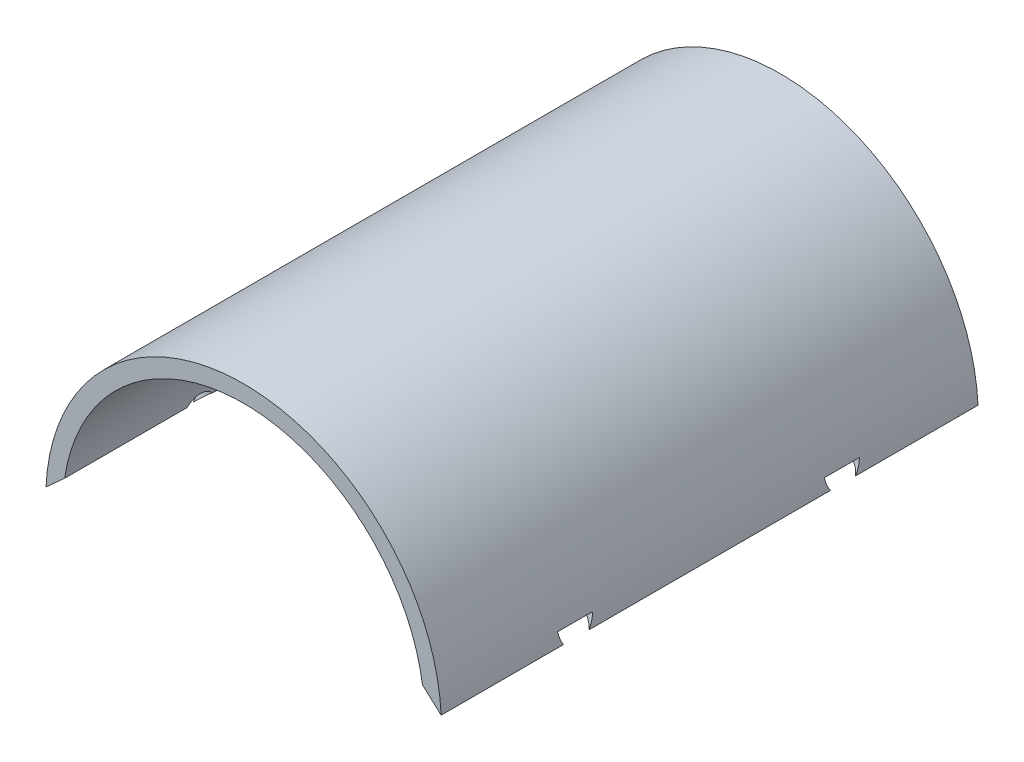
ISO-10303-21;
HEADER;
FILE_DESCRIPTION(('STEP AP214'),'2;1');
FILE_NAME('part.step','',(''),(''),'','','');
FILE_SCHEMA(('AUTOMOTIVE_DESIGN { 1 0 10303 214 1 1 1 1 }'));
ENDSEC;
DATA;
#1=APPLICATION_CONTEXT('core data for automotive mechanical design processes');
#2=APPLICATION_PROTOCOL_DEFINITION('international standard','automotive_design',2000,#1);
#3=PRODUCT_CONTEXT('',#1,'mechanical');
#4=PRODUCT('Part','Part','',(#3));
#5=PRODUCT_RELATED_PRODUCT_CATEGORY('part','',(#4));
#6=PRODUCT_DEFINITION_FORMATION('','',#4);
#7=PRODUCT_DEFINITION_CONTEXT('part definition',#1,'design');
#8=PRODUCT_DEFINITION('design','',#6,#7);
#9=PRODUCT_DEFINITION_SHAPE('','',#8);
#10=(LENGTH_UNIT() NAMED_UNIT(*) SI_UNIT(.MILLI.,.METRE.));
#11=(NAMED_UNIT(*) PLANE_ANGLE_UNIT() SI_UNIT($,.RADIAN.));
#12=(NAMED_UNIT(*) SI_UNIT($,.STERADIAN.) SOLID_ANGLE_UNIT());
#13=UNCERTAINTY_MEASURE_WITH_UNIT(LENGTH_MEASURE(1.E-05),#10,'distance_accuracy_value','');
#14=(GEOMETRIC_REPRESENTATION_CONTEXT(3) GLOBAL_UNCERTAINTY_ASSIGNED_CONTEXT((#13)) GLOBAL_UNIT_ASSIGNED_CONTEXT((#10,
#11,#12)) REPRESENTATION_CONTEXT('',''));
#15=CARTESIAN_POINT('',(0.,0.,0.));
#16=DIRECTION('',(0.,0.,1.));
#17=DIRECTION('',(1.,0.,0.));
#18=AXIS2_PLACEMENT_3D('',#15,#16,#17);
#19=CARTESIAN_POINT('',(40.2038837694651,5.93778829627168,120.65));
#20=DIRECTION('',(0.672307408747508,0.740272077106257,0.));
#21=DIRECTION('',(-0.740272077106257,0.672307408747508,0.));
#22=AXIS2_PLACEMENT_3D('',#19,#20,#21);
#23=PLANE('',#22);
#24=DIRECTION('',(0.,0.,-1.));
#25=VECTOR('',#24,1.);
#26=CARTESIAN_POINT('',(40.2038837694651,5.93778829627168,120.65));
#27=LINE('',#26,#25);
#28=CARTESIAN_POINT('',(40.2038837694651,5.93778829627168,87.4736801787405));
#29=VERTEX_POINT('',#28);
#30=CARTESIAN_POINT('',(40.2038837694651,5.93778829627168,33.1763198212595));
#31=VERTEX_POINT('',#30);
#32=EDGE_CURVE('E176',#29,#31,#27,.T.);
#33=ORIENTED_EDGE('',*,*,#32,.T.);
#34=CARTESIAN_POINT('',(42.3014633715025,4.03278829627168,30.353));
#35=DIRECTION('',(-0.672307408747508,-0.740272077106257,0.));
#36=DIRECTION('',(-0.740272077106257,0.672307408747508,0.));
#37=AXIS2_PLACEMENT_3D('',#34,#35,#36);
#38=CIRCLE('',#37,4.00000000000002);
#39=CARTESIAN_POINT('',(44.39904297354,2.12778829627168,33.1763198212595));
#40=VERTEX_POINT('',#39);
#41=EDGE_CURVE('E158',#40,#31,#38,.T.);
#42=ORIENTED_EDGE('',*,*,#41,.F.);
#43=DIRECTION('',(0.,0.,-1.));
#44=VECTOR('',#43,1.);
#45=CARTESIAN_POINT('',(44.39904297354,2.12778829627168,120.65));
#46=LINE('',#45,#44);
#47=CARTESIAN_POINT('',(44.39904297354,2.12778829627168,87.4736801787405));
#48=VERTEX_POINT('',#47);
#49=EDGE_CURVE('E181',#48,#40,#46,.T.);
#50=ORIENTED_EDGE('',*,*,#49,.F.);
#51=CARTESIAN_POINT('',(42.3014633715025,4.03278829627168,90.297));
#52=DIRECTION('',(-0.672307408747508,-0.740272077106257,0.));
#53=DIRECTION('',(0.740272077106257,-0.672307408747508,0.));
#54=AXIS2_PLACEMENT_3D('',#51,#52,#53);
#55=CIRCLE('',#54,4.00000000000002);
#56=EDGE_CURVE('E163',#29,#48,#55,.T.);
#57=ORIENTED_EDGE('',*,*,#56,.F.);
#58=EDGE_LOOP('',(#33,#42,#50,#57));
#59=FACE_BOUND('',#58,.T.);
#60=ADVANCED_FACE('F35',(#59),#23,.F.);
#61=CARTESIAN_POINT('',(40.2038837694651,5.93778829627168,120.65));
#62=VERTEX_POINT('',#61);
#63=CARTESIAN_POINT('',(40.2038837694651,5.93778829627168,93.1203198212595));
#64=VERTEX_POINT('',#63);
#65=EDGE_CURVE('E179',#62,#64,#27,.T.);
#66=ORIENTED_EDGE('',*,*,#65,.T.);
#67=CARTESIAN_POINT('',(44.39904297354,2.12778829627168,93.1203198212595));
#68=VERTEX_POINT('',#67);
#69=EDGE_CURVE('E241',#68,#64,#55,.T.);
#70=ORIENTED_EDGE('',*,*,#69,.F.);
#71=CARTESIAN_POINT('',(44.39904297354,2.12778829627168,120.65));
#72=VERTEX_POINT('',#71);
#73=EDGE_CURVE('E177',#72,#68,#46,.T.);
#74=ORIENTED_EDGE('',*,*,#73,.F.);
#75=DIRECTION('',(0.740272077106257,-0.672307408747507,0.));
#76=VECTOR('',#75,1.);
#77=CARTESIAN_POINT('',(40.2038837694651,5.93778829627168,120.65));
#78=LINE('',#77,#76);
#79=EDGE_CURVE('E306',#62,#72,#78,.T.);
#80=ORIENTED_EDGE('',*,*,#79,.F.);
#81=EDGE_LOOP('',(#66,#70,#74,#80));
#82=FACE_BOUND('',#81,.T.);
#83=ADVANCED_FACE('F353',(#82),#23,.F.);
#84=CARTESIAN_POINT('',(-40.2038837694651,5.93778829627168,120.65));
#85=DIRECTION('',(-0.672307408747508,0.740272077106257,0.));
#86=DIRECTION('',(-0.740272077106257,-0.672307408747508,0.));
#87=AXIS2_PLACEMENT_3D('',#84,#85,#86);
#88=PLANE('',#87);
#89=DIRECTION('',(0.,0.,-1.));
#90=VECTOR('',#89,1.);
#91=CARTESIAN_POINT('',(-44.39904297354,2.12778829627168,120.65));
#92=LINE('',#91,#90);
#93=CARTESIAN_POINT('',(-44.39904297354,2.12778829627168,87.5259892151859));
#94=VERTEX_POINT('',#93);
#95=CARTESIAN_POINT('',(-44.39904297354,2.12778829627168,33.1240107848141));
#96=VERTEX_POINT('',#95);
#97=EDGE_CURVE('E329',#94,#96,#92,.T.);
#98=ORIENTED_EDGE('',*,*,#97,.T.);
#99=CARTESIAN_POINT('',(-42.3014633715025,4.03278829627168,30.3006909635546));
#100=DIRECTION('',(-0.672307408747508,0.740272077106257,0.));
#101=DIRECTION('',(-0.740272077106257,-0.672307408747508,0.));
#102=AXIS2_PLACEMENT_3D('',#99,#100,#101);
#103=CIRCLE('',#102,4.);
#104=CARTESIAN_POINT('',(-40.2038837694651,5.93778829627168,33.1240107848141));
#105=VERTEX_POINT('',#104);
#106=EDGE_CURVE('E195',#96,#105,#103,.T.);
#107=ORIENTED_EDGE('',*,*,#106,.T.);
#108=DIRECTION('',(0.,0.,-1.));
#109=VECTOR('',#108,1.);
#110=CARTESIAN_POINT('',(-40.2038837694651,5.93778829627168,120.65));
#111=LINE('',#110,#109);
#112=CARTESIAN_POINT('',(-40.2038837694651,5.93778829627169,87.5259892151859));
#113=VERTEX_POINT('',#112);
#114=EDGE_CURVE('E326',#113,#105,#111,.T.);
#115=ORIENTED_EDGE('',*,*,#114,.F.);
#116=CARTESIAN_POINT('',(-42.3014633715025,4.03278829627168,90.3493090364454));
#117=DIRECTION('',(-0.672307408747508,0.740272077106257,0.));
#118=DIRECTION('',(-0.740272077106257,-0.672307408747508,0.));
#119=AXIS2_PLACEMENT_3D('',#116,#117,#118);
#120=CIRCLE('',#119,4.);
#121=EDGE_CURVE('E185',#113,#94,#120,.T.);
#122=ORIENTED_EDGE('',*,*,#121,.T.);
#123=EDGE_LOOP('',(#98,#107,#115,#122));
#124=FACE_BOUND('',#123,.T.);
#125=ADVANCED_FACE('F358',(#124),#88,.F.);
#126=CARTESIAN_POINT('',(-44.39904297354,2.12778829627168,120.65));
#127=VERTEX_POINT('',#126);
#128=CARTESIAN_POINT('',(-44.39904297354,2.12778829627168,93.1726288577048));
#129=VERTEX_POINT('',#128);
#130=EDGE_CURVE('E327',#127,#129,#92,.T.);
#131=ORIENTED_EDGE('',*,*,#130,.T.);
#132=CARTESIAN_POINT('',(-42.3014633715025,4.03278829627168,90.3493090364454));
#133=DIRECTION('',(0.672307408747508,-0.740272077106257,0.));
#134=DIRECTION('',(0.740272077106257,0.672307408747508,0.));
#135=AXIS2_PLACEMENT_3D('',#132,#133,#134);
#136=CIRCLE('',#135,4.);
#137=CARTESIAN_POINT('',(-40.2038837694651,5.93778829627169,93.1726288577048));
#138=VERTEX_POINT('',#137);
#139=EDGE_CURVE('E272',#138,#129,#136,.T.);
#140=ORIENTED_EDGE('',*,*,#139,.F.);
#141=CARTESIAN_POINT('',(-40.2038837694651,5.93778829627168,120.65));
#142=VERTEX_POINT('',#141);
#143=EDGE_CURVE('E322',#142,#138,#111,.T.);
#144=ORIENTED_EDGE('',*,*,#143,.F.);
#145=DIRECTION('',(0.740272077106257,0.672307408747507,0.));
#146=VECTOR('',#145,1.);
#147=CARTESIAN_POINT('',(-40.2038837694651,5.93778829627168,120.65));
#148=LINE('',#147,#146);
#149=EDGE_CURVE('E311',#127,#142,#148,.T.);
#150=ORIENTED_EDGE('',*,*,#149,.F.);
#151=EDGE_LOOP('',(#131,#140,#144,#150));
#152=FACE_BOUND('',#151,.T.);
#153=ADVANCED_FACE('F364',(#152),#88,.F.);
#154=CARTESIAN_POINT('',(0.,0.,120.65));
#155=DIRECTION('',(0.,0.,-1.));
#156=DIRECTION('',(-1.,0.,0.));
#157=AXIS2_PLACEMENT_3D('',#154,#155,#156);
#158=CYLINDRICAL_SURFACE('',#157,40.64);
#159=CARTESIAN_POINT('',(40.2038837694651,5.93778829627168,27.5296801787405));
#160=VERTEX_POINT('',#159);
#161=CARTESIAN_POINT('',(40.2038837694651,5.93778829627168,0.));
#162=VERTEX_POINT('',#161);
#163=EDGE_CURVE('E169',#160,#162,#27,.T.);
#164=ORIENTED_EDGE('',*,*,#163,.F.);
#165=CARTESIAN_POINT('',(40.2038837694651,5.93778829627168,27.5296801787405));
#166=CARTESIAN_POINT('',(40.1913132421633,6.02291585990195,27.596451012384));
#167=CARTESIAN_POINT('',(40.1788118055654,6.10567612462735,27.6663090284334));
#168=CARTESIAN_POINT('',(40.1541531544196,6.26578865022539,27.8121564919255));
#169=CARTESIAN_POINT('',(40.141996254572,6.34313605606763,27.8881513154342));
#170=CARTESIAN_POINT('',(40.1181724615959,6.49211688683358,28.0466650040298));
#171=CARTESIAN_POINT('',(40.1065096054522,6.56370640806695,28.1292259066478));
#172=CARTESIAN_POINT('',(40.084010278307,6.69973661307581,28.3001383550985));
#173=CARTESIAN_POINT('',(40.0731736749685,6.76417844241919,28.3884889693869));
#174=CARTESIAN_POINT('',(40.0525137129598,6.88545967671024,28.5711581372088));
#175=CARTESIAN_POINT('',(40.0426967734591,6.94225151658457,28.6655091010737));
#176=CARTESIAN_POINT('',(40.0244097045485,7.04691787405929,28.8591039358884));
#177=CARTESIAN_POINT('',(40.0159388212325,7.09479738591597,28.9583450268524));
#178=CARTESIAN_POINT('',(40.0005991194072,7.18077811889624,29.1607622636441));
#179=CARTESIAN_POINT('',(39.9937256904317,7.21890751291722,29.2639260593821));
#180=CARTESIAN_POINT('',(39.9817585070471,7.28489638060097,29.4735846116719));
#181=CARTESIAN_POINT('',(39.9766644580635,7.31275755419963,29.5800788136948));
#182=CARTESIAN_POINT('',(39.9688951209998,7.3550954287587,29.7829319276881));
#183=CARTESIAN_POINT('',(39.9660082465001,7.37074734269621,29.879038760085));
#184=CARTESIAN_POINT('',(39.9618273423075,7.39338141912512,30.0722982070598));
#185=CARTESIAN_POINT('',(39.9605331676218,7.40036437080399,30.1694507256303));
#186=CARTESIAN_POINT('',(39.959572741404,7.40554902528821,30.3640426896164));
#187=CARTESIAN_POINT('',(39.9599071437956,7.4037472007363,30.4614822345852));
#188=CARTESIAN_POINT('',(39.9621931505267,7.39139675083092,30.6557577855384));
#189=CARTESIAN_POINT('',(39.9641446988048,7.38084842869079,30.7525938123277));
#190=CARTESIAN_POINT('',(39.9719414920248,7.33855241593988,31.0263064206819));
#191=CARTESIAN_POINT('',(39.9796837595756,7.29642130763879,31.201631266668));
#192=CARTESIAN_POINT('',(39.999871326816,7.18491731329966,31.5428936292308));
#193=CARTESIAN_POINT('',(40.0123158095611,7.11554915923653,31.7088327706885));
#194=CARTESIAN_POINT('',(40.0415424936381,6.94923599022486,32.0348167729333));
#195=CARTESIAN_POINT('',(40.0584870977926,6.85124076692097,32.1943081757798));
#196=CARTESIAN_POINT('',(40.095192960951,6.63304538763832,32.4969532611374));
#197=CARTESIAN_POINT('',(40.1149555090133,6.51283506194859,32.6400994123058));
#198=CARTESIAN_POINT('',(40.1465702815048,6.31406979300915,32.8466060183779));
#199=CARTESIAN_POINT('',(40.1578673895727,6.24187114155978,32.9163169061829));
#200=CARTESIAN_POINT('',(40.1807169493678,6.09304946759938,33.0503146031002));
#201=CARTESIAN_POINT('',(40.1922684964993,6.01644092130682,33.1146176253914));
#202=CARTESIAN_POINT('',(40.2038837694651,5.93778829627168,33.1763198212595));
#203=B_SPLINE_CURVE_WITH_KNOTS('',3,(#165,#166,#167,#168,#169,#170,#171,#172,#173,#174,#175,
#176,#177,#178,#179,#180,#181,#182,#183,#184,#185,#186,#187,#188,#189,#190,#191,#192,#193,#194,
#195,#196,#197,#198,#199,#200,#201,#202),.UNSPECIFIED.,.F.,.F.,(4,2,2,2,2,2,2,2,2,2,2,2,2,2,2,2,
2,2,4),(0.,0.326735220214415,0.653759843865201,0.98307921047325,1.312345720231,1.64357330309619,
1.97461471142325,2.30468848457326,2.63470758840895,2.92656284759356,3.21839153549948,
3.51033741122769,3.80227316654107,4.34104349743155,4.87972026749844,5.4413775079196,
6.00329250565088,6.30606558674257,6.60789591837461),.UNSPECIFIED.);
#204=EDGE_CURVE('E153',#160,#31,#203,.T.);
#205=ORIENTED_EDGE('',*,*,#204,.T.);
#206=ORIENTED_EDGE('',*,*,#32,.F.);
#207=CARTESIAN_POINT('',(40.2038837694651,5.93778829627168,87.4736801787405));
#208=CARTESIAN_POINT('',(40.1913132421633,6.02291585990195,87.540451012384));
#209=CARTESIAN_POINT('',(40.1788118055654,6.10567612462735,87.6103090284334));
#210=CARTESIAN_POINT('',(40.1541531544196,6.26578865022539,87.7561564919255));
#211=CARTESIAN_POINT('',(40.141996254572,6.34313605606764,87.8321513154342));
#212=CARTESIAN_POINT('',(40.1181724615959,6.49211688683358,87.9906650040298));
#213=CARTESIAN_POINT('',(40.1065096054522,6.56370640806694,88.0732259066478));
#214=CARTESIAN_POINT('',(40.084010278307,6.6997366130758,88.2441383550985));
#215=CARTESIAN_POINT('',(40.0731736749685,6.76417844241919,88.3324889693869));
#216=CARTESIAN_POINT('',(40.0525137129598,6.88545967671024,88.5151581372088));
#217=CARTESIAN_POINT('',(40.0426967734591,6.94225151658456,88.6095091010737));
#218=CARTESIAN_POINT('',(40.0244097045485,7.04691787405929,88.8031039358883));
#219=CARTESIAN_POINT('',(40.0159388212325,7.09479738591596,88.9023450268524));
#220=CARTESIAN_POINT('',(40.0005991194072,7.18077811889623,89.1047622636441));
#221=CARTESIAN_POINT('',(39.9937256904317,7.21890751291721,89.2079260593821));
#222=CARTESIAN_POINT('',(39.9817585070471,7.28489638060097,89.4175846116719));
#223=CARTESIAN_POINT('',(39.9766644580635,7.31275755419963,89.5240788136948));
#224=CARTESIAN_POINT('',(39.9688951209998,7.3550954287587,89.7269319276881));
#225=CARTESIAN_POINT('',(39.9660082465001,7.37074734269621,89.823038760085));
#226=CARTESIAN_POINT('',(39.9618273423075,7.39338141912511,90.0162982070597));
#227=CARTESIAN_POINT('',(39.9605331676218,7.40036437080399,90.1134507256303));
#228=CARTESIAN_POINT('',(39.959572741404,7.40554902528821,90.3080426896164));
#229=CARTESIAN_POINT('',(39.9599071437956,7.4037472007363,90.4054822345852));
#230=CARTESIAN_POINT('',(39.9621931505267,7.39139675083092,90.5997577855384));
#231=CARTESIAN_POINT('',(39.9641446988048,7.38084842869079,90.6965938123276));
#232=CARTESIAN_POINT('',(39.9719414920248,7.33855241593988,90.9703064206819));
#233=CARTESIAN_POINT('',(39.9796837595757,7.29642130763879,91.1456312666679));
#234=CARTESIAN_POINT('',(39.999871326816,7.18491731329966,91.4868936292307));
#235=CARTESIAN_POINT('',(40.0123158095611,7.11554915923654,91.6528327706884));
#236=CARTESIAN_POINT('',(40.0415424936381,6.94923599022487,91.9788167729333));
#237=CARTESIAN_POINT('',(40.0584870977926,6.85124076692097,92.1383081757797));
#238=CARTESIAN_POINT('',(40.095192960951,6.63304538763832,92.4409532611373));
#239=CARTESIAN_POINT('',(40.1149555090133,6.51283506194859,92.5840994123058));
#240=CARTESIAN_POINT('',(40.1465702815048,6.31406979300915,92.7906060183779));
#241=CARTESIAN_POINT('',(40.1578673895727,6.24187114155979,92.8603169061829));
#242=CARTESIAN_POINT('',(40.1807169493678,6.09304946759939,92.9943146031002));
#243=CARTESIAN_POINT('',(40.1922684964993,6.01644092130683,93.0586176253914));
#244=CARTESIAN_POINT('',(40.2038837694651,5.93778829627168,93.1203198212595));
#245=B_SPLINE_CURVE_WITH_KNOTS('',3,(#207,#208,#209,#210,#211,#212,#213,#214,#215,#216,#217,
#218,#219,#220,#221,#222,#223,#224,#225,#226,#227,#228,#229,#230,#231,#232,#233,#234,#235,#236,
#237,#238,#239,#240,#241,#242,#243,#244),.UNSPECIFIED.,.F.,.F.,(4,2,2,2,2,2,2,2,2,2,2,2,2,2,2,2,
2,2,4),(0.,0.326735220214426,0.653759843865201,0.983079210473233,1.312345720231,
1.64357330309617,1.97461471142324,2.30468848457325,2.63470758840894,2.92656284759355,
3.21839153549947,3.5103374112277,3.80227316654106,4.34104349743154,4.87972026749842,
5.44137750791958,6.00329250565088,6.30606558674256,6.60789591837461),.UNSPECIFIED.);
#246=EDGE_CURVE('E233',#29,#64,#245,.T.);
#247=ORIENTED_EDGE('',*,*,#246,.T.);
#248=ORIENTED_EDGE('',*,*,#65,.F.);
#249=CARTESIAN_POINT('',(0.,0.,120.65));
#250=DIRECTION('',(0.,0.,-1.));
#251=DIRECTION('',(1.,0.,0.));
#252=AXIS2_PLACEMENT_3D('',#249,#250,#251);
#253=CIRCLE('',#252,40.64);
#254=EDGE_CURVE('E303',#142,#62,#253,.T.);
#255=ORIENTED_EDGE('',*,*,#254,.F.);
#256=ORIENTED_EDGE('',*,*,#143,.T.);
#257=CARTESIAN_POINT('',(-40.2038837694651,5.93778829627167,93.1726288577048));
#258=CARTESIAN_POINT('',(-40.1913132421633,6.02291585990194,93.1058580240613));
#259=CARTESIAN_POINT('',(-40.1788118055654,6.10567612462734,93.0360000080119));
#260=CARTESIAN_POINT('',(-40.1541531544196,6.26578865022537,92.8901525445199));
#261=CARTESIAN_POINT('',(-40.141996254572,6.34313605606762,92.8141577210111));
#262=CARTESIAN_POINT('',(-40.1181724615959,6.49211688683357,92.6556440324156));
#263=CARTESIAN_POINT('',(-40.1065096054522,6.56370640806693,92.5730831297976));
#264=CARTESIAN_POINT('',(-40.084010278307,6.6997366130758,92.4021706813468));
#265=CARTESIAN_POINT('',(-40.0731736749685,6.76417844241918,92.3138200670584));
#266=CARTESIAN_POINT('',(-40.0525137129598,6.88545967671023,92.1311508992366));
#267=CARTESIAN_POINT('',(-40.0426967734591,6.94225151658455,92.0367999353717));
#268=CARTESIAN_POINT('',(-40.0244097045485,7.04691787405928,91.843205100557));
#269=CARTESIAN_POINT('',(-40.0159388212325,7.09479738591595,91.743964009593));
#270=CARTESIAN_POINT('',(-40.0005991194072,7.18077811889622,91.5415467728012));
#271=CARTESIAN_POINT('',(-39.9937256904317,7.2189075129172,91.4383829770633));
#272=CARTESIAN_POINT('',(-39.9817585070471,7.28489638060096,91.2287244247735));
#273=CARTESIAN_POINT('',(-39.9766644580635,7.31275755419961,91.1222302227506));
#274=CARTESIAN_POINT('',(-39.9688951209998,7.35509542875868,90.9193771087572));
#275=CARTESIAN_POINT('',(-39.9660082465001,7.3707473426962,90.8232702763604));
#276=CARTESIAN_POINT('',(-39.9618273423075,7.3933814191251,90.6300108293856));
#277=CARTESIAN_POINT('',(-39.9605331676218,7.40036437080398,90.5328583108151));
#278=CARTESIAN_POINT('',(-39.959572741404,7.4055490252882,90.338266346829));
#279=CARTESIAN_POINT('',(-39.9599071437956,7.40374720073629,90.2408268018602));
#280=CARTESIAN_POINT('',(-39.9621931505267,7.39139675083091,90.0465512509069));
#281=CARTESIAN_POINT('',(-39.9641446988048,7.38084842869078,89.9497152241177));
#282=CARTESIAN_POINT('',(-39.9719414920248,7.33855241593987,89.6760026157635));
#283=CARTESIAN_POINT('',(-39.9796837595757,7.29642130763877,89.5006777697774));
#284=CARTESIAN_POINT('',(-39.999871326816,7.18491731329965,89.1594154072146));
#285=CARTESIAN_POINT('',(-40.0123158095611,7.11554915923652,88.9934762657569));
#286=CARTESIAN_POINT('',(-40.0415424936381,6.94923599022484,88.667492263512));
#287=CARTESIAN_POINT('',(-40.0584870977926,6.85124076692095,88.5080008606656));
#288=CARTESIAN_POINT('',(-40.095192960951,6.63304538763829,88.205355775308));
#289=CARTESIAN_POINT('',(-40.1149555090133,6.51283506194857,88.0622096241396));
#290=CARTESIAN_POINT('',(-40.1465702815048,6.31406979300912,87.8557030180675));
#291=CARTESIAN_POINT('',(-40.1578673895727,6.24187114155976,87.7859921302624));
#292=CARTESIAN_POINT('',(-40.1807169493678,6.09304946759937,87.6519944333452));
#293=CARTESIAN_POINT('',(-40.1922684964993,6.01644092130681,87.587691411054));
#294=CARTESIAN_POINT('',(-40.2038837694651,5.93778829627167,87.5259892151859));
#295=B_SPLINE_CURVE_WITH_KNOTS('',3,(#257,#258,#259,#260,#261,#262,#263,#264,#265,#266,#267,
#268,#269,#270,#271,#272,#273,#274,#275,#276,#277,#278,#279,#280,#281,#282,#283,#284,#285,#286,
#287,#288,#289,#290,#291,#292,#293,#294),.UNSPECIFIED.,.F.,.F.,(4,2,2,2,2,2,2,2,2,2,2,2,2,2,2,2,
2,2,4),(0.,0.326735220214421,0.653759843865193,0.983079210473235,1.312345720231,
1.64357330309616,1.97461471142325,2.30468848457324,2.63470758840894,2.92656284759352,
3.21839153549946,3.51033741122766,3.80227316654105,4.34104349743152,4.87972026749842,
5.44137750791959,6.00329250565087,6.30606558674255,6.60789591837458),.UNSPECIFIED.);
#296=EDGE_CURVE('E297',#138,#113,#295,.T.);
#297=ORIENTED_EDGE('',*,*,#296,.T.);
#298=ORIENTED_EDGE('',*,*,#114,.T.);
#299=CARTESIAN_POINT('',(-40.2038837694651,5.93778829627168,33.1240107848141));
#300=CARTESIAN_POINT('',(-40.1913132421633,6.02291585990194,33.0572399511706));
#301=CARTESIAN_POINT('',(-40.1788118055654,6.10567612462734,32.9873819351212));
#302=CARTESIAN_POINT('',(-40.1541531544196,6.26578865022537,32.8415344716291));
#303=CARTESIAN_POINT('',(-40.141996254572,6.34313605606762,32.7655396481204));
#304=CARTESIAN_POINT('',(-40.1181724615959,6.49211688683357,32.6070259595248));
#305=CARTESIAN_POINT('',(-40.1065096054522,6.56370640806693,32.5244650569068));
#306=CARTESIAN_POINT('',(-40.084010278307,6.6997366130758,32.3535526084561));
#307=CARTESIAN_POINT('',(-40.0731736749685,6.76417844241917,32.2652019941677));
#308=CARTESIAN_POINT('',(-40.0525137129598,6.88545967671023,32.0825328263458));
#309=CARTESIAN_POINT('',(-40.0426967734591,6.94225151658456,31.988181862481));
#310=CARTESIAN_POINT('',(-40.0244097045485,7.04691787405929,31.7945870276663));
#311=CARTESIAN_POINT('',(-40.0159388212325,7.09479738591596,31.6953459367022));
#312=CARTESIAN_POINT('',(-40.0005991194072,7.18077811889622,31.4929286999105));
#313=CARTESIAN_POINT('',(-39.9937256904317,7.21890751291721,31.3897649041725));
#314=CARTESIAN_POINT('',(-39.9817585070471,7.28489638060096,31.1801063518827));
#315=CARTESIAN_POINT('',(-39.9766644580635,7.31275755419961,31.0736121498598));
#316=CARTESIAN_POINT('',(-39.9688951209998,7.35509542875868,30.8707590358665));
#317=CARTESIAN_POINT('',(-39.9660082465001,7.3707473426962,30.7746522034696));
#318=CARTESIAN_POINT('',(-39.9618273423075,7.3933814191251,30.5813927564949));
#319=CARTESIAN_POINT('',(-39.9605331676218,7.40036437080397,30.4842402379243));
#320=CARTESIAN_POINT('',(-39.959572741404,7.40554902528819,30.2896482739382));
#321=CARTESIAN_POINT('',(-39.9599071437956,7.40374720073629,30.1922087289694));
#322=CARTESIAN_POINT('',(-39.9621931505267,7.39139675083091,29.9979331780162));
#323=CARTESIAN_POINT('',(-39.9641446988048,7.38084842869078,29.901097151227));
#324=CARTESIAN_POINT('',(-39.9719414920248,7.33855241593987,29.6273845428728));
#325=CARTESIAN_POINT('',(-39.9796837595757,7.29642130763878,29.4520596968867));
#326=CARTESIAN_POINT('',(-39.999871326816,7.18491731329965,29.1107973343239));
#327=CARTESIAN_POINT('',(-40.0123158095611,7.11554915923652,28.9448581928662));
#328=CARTESIAN_POINT('',(-40.0415424936381,6.94923599022484,28.6188741906213));
#329=CARTESIAN_POINT('',(-40.0584870977926,6.85124076692095,28.4593827877749));
#330=CARTESIAN_POINT('',(-40.095192960951,6.6330453876383,28.1567377024173));
#331=CARTESIAN_POINT('',(-40.1149555090133,6.51283506194858,28.0135915512489));
#332=CARTESIAN_POINT('',(-40.1465702815048,6.31406979300913,27.8070849451767));
#333=CARTESIAN_POINT('',(-40.1578673895727,6.24187114155977,27.7373740573717));
#334=CARTESIAN_POINT('',(-40.1807169493678,6.09304946759938,27.6033763604544));
#335=CARTESIAN_POINT('',(-40.1922684964993,6.01644092130682,27.5390733381633));
#336=CARTESIAN_POINT('',(-40.2038837694651,5.93778829627167,27.4773711422952));
#337=B_SPLINE_CURVE_WITH_KNOTS('',3,(#299,#300,#301,#302,#303,#304,#305,#306,#307,#308,#309,
#310,#311,#312,#313,#314,#315,#316,#317,#318,#319,#320,#321,#322,#323,#324,#325,#326,#327,#328,
#329,#330,#331,#332,#333,#334,#335,#336),.UNSPECIFIED.,.F.,.F.,(4,2,2,2,2,2,2,2,2,2,2,2,2,2,2,2,
2,2,4),(0.,0.326735220214414,0.653759843865197,0.983079210473239,1.31234572023099,
1.64357330309618,1.97461471142325,2.30468848457325,2.63470758840894,2.92656284759353,
3.21839153549946,3.51033741122767,3.80227316654105,4.34104349743152,4.87972026749841,
5.44137750791957,6.00329250565085,6.30606558674253,6.60789591837457),.UNSPECIFIED.);
#338=CARTESIAN_POINT('',(-40.2038837694651,5.93778829627168,27.4773711422952));
#339=VERTEX_POINT('',#338);
#340=EDGE_CURVE('E266',#105,#339,#337,.T.);
#341=ORIENTED_EDGE('',*,*,#340,.T.);
#342=CARTESIAN_POINT('',(-40.2038837694651,5.93778829627168,0.));
#343=VERTEX_POINT('',#342);
#344=EDGE_CURVE('E313',#339,#343,#111,.T.);
#345=ORIENTED_EDGE('',*,*,#344,.T.);
#346=CARTESIAN_POINT('',(0.,0.,0.));
#347=DIRECTION('',(0.,0.,-1.));
#348=DIRECTION('',(1.,0.,0.));
#349=AXIS2_PLACEMENT_3D('',#346,#347,#348);
#350=CIRCLE('',#349,40.64);
#351=EDGE_CURVE('E175',#343,#162,#350,.T.);
#352=ORIENTED_EDGE('',*,*,#351,.T.);
#353=EDGE_LOOP('',(#164,#205,#206,#247,#248,#255,#256,#297,#298,#341,#345,#352));
#354=FACE_BOUND('',#353,.T.);
#355=ADVANCED_FACE('F37',(#354),#158,.F.);
#356=CARTESIAN_POINT('',(44.39904297354,2.12778829627168,27.5296801787405));
#357=VERTEX_POINT('',#356);
#358=CARTESIAN_POINT('',(44.39904297354,2.12778829627168,0.));
#359=VERTEX_POINT('',#358);
#360=EDGE_CURVE('E171',#357,#359,#46,.T.);
#361=ORIENTED_EDGE('',*,*,#360,.F.);
#362=EDGE_CURVE('E156',#160,#357,#38,.T.);
#363=ORIENTED_EDGE('',*,*,#362,.F.);
#364=ORIENTED_EDGE('',*,*,#163,.T.);
#365=DIRECTION('',(0.740272077106257,-0.672307408747507,0.));
#366=VECTOR('',#365,1.);
#367=CARTESIAN_POINT('',(40.2038837694651,5.93778829627168,0.));
#368=LINE('',#367,#366);
#369=EDGE_CURVE('E315',#162,#359,#368,.T.);
#370=ORIENTED_EDGE('',*,*,#369,.T.);
#371=EDGE_LOOP('',(#361,#363,#364,#370));
#372=FACE_BOUND('',#371,.T.);
#373=ADVANCED_FACE('F167',(#372),#23,.F.);
#374=CARTESIAN_POINT('',(0.,0.,120.65));
#375=DIRECTION('',(0.,0.,-1.));
#376=DIRECTION('',(-1.,0.,0.));
#377=AXIS2_PLACEMENT_3D('',#374,#375,#376);
#378=CYLINDRICAL_SURFACE('',#377,44.45);
#379=DIRECTION('',(0.,0.,-1.));
#380=VECTOR('',#379,1.);
#381=CARTESIAN_POINT('',(44.1628902552898,5.0439691017319,120.65));
#382=LINE('',#381,#380);
#383=CARTESIAN_POINT('',(44.1628902552898,5.0439691017319,34.2916042369071));
#384=VERTEX_POINT('',#383);
#385=CARTESIAN_POINT('',(44.1628902552898,5.0439691017319,26.4143957630929));
#386=VERTEX_POINT('',#385);
#387=EDGE_CURVE('E499',#384,#386,#382,.T.);
#388=ORIENTED_EDGE('',*,*,#387,.T.);
#389=CARTESIAN_POINT('',(44.1628902552898,5.0439691017319,26.4143957630929));
#390=CARTESIAN_POINT('',(44.1820882207202,4.87594230518134,26.4369589502951));
#391=CARTESIAN_POINT('',(44.2002218425883,4.70860522803788,26.465614336531));
#392=CARTESIAN_POINT('',(44.2343731536034,4.37612964124249,26.5350658009129));
#393=CARTESIAN_POINT('',(44.2503893669069,4.21099273646198,26.575870283281));
#394=CARTESIAN_POINT('',(44.2800115624876,3.8870390773206,26.6686662679598));
#395=CARTESIAN_POINT('',(44.2936571173332,3.72816187528309,26.7204335879432));
#396=CARTESIAN_POINT('',(44.3189313479414,3.41460828009221,26.8356300748707));
#397=CARTESIAN_POINT('',(44.330560895291,3.25993009608054,26.8990541776434));
#398=CARTESIAN_POINT('',(44.3531677738895,2.93737590671437,27.0461843089747));
#399=CARTESIAN_POINT('',(44.363895738379,2.77016886967958,27.1314161147886));
#400=CARTESIAN_POINT('',(44.3783028882209,2.52498528170084,27.2712161995369));
#401=CARTESIAN_POINT('',(44.3828439396484,2.44378091214642,27.3200991618397));
#402=CARTESIAN_POINT('',(44.3913614431513,2.28384625817868,27.4218688486936));
#403=CARTESIAN_POINT('',(44.3953376652043,2.20511699183729,27.4747571910389));
#404=CARTESIAN_POINT('',(44.39904297354,2.12778829627168,27.5296801787405));
#405=B_SPLINE_CURVE_WITH_KNOTS('',3,(#389,#390,#391,#392,#393,#394,#395,#396,#397,#398,#399,
#400,#401,#402,#403,#404),.UNSPECIFIED.,.F.,.F.,(4,2,2,2,2,2,2,4),(0.,0.511752184475265,
1.0238592028553,1.52636097799275,2.02864496014023,2.59173143963583,2.87630157654165,
3.16098727221963),.UNSPECIFIED.);
#406=EDGE_CURVE('E11',#386,#357,#405,.T.);
#407=ORIENTED_EDGE('',*,*,#406,.T.);
#408=ORIENTED_EDGE('',*,*,#360,.T.);
#409=CARTESIAN_POINT('',(0.,0.,0.));
#410=DIRECTION('',(0.,0.,1.));
#411=DIRECTION('',(1.,0.,0.));
#412=AXIS2_PLACEMENT_3D('',#409,#410,#411);
#413=CIRCLE('',#412,44.45);
#414=CARTESIAN_POINT('',(-44.39904297354,2.12778829627168,0.));
#415=VERTEX_POINT('',#414);
#416=EDGE_CURVE('E317',#359,#415,#413,.T.);
#417=ORIENTED_EDGE('',*,*,#416,.T.);
#418=CARTESIAN_POINT('',(-44.39904297354,2.12778829627168,27.4773711422952));
#419=VERTEX_POINT('',#418);
#420=EDGE_CURVE('E325',#419,#415,#92,.T.);
#421=ORIENTED_EDGE('',*,*,#420,.F.);
#422=CARTESIAN_POINT('',(-44.39904297354,2.12778829627168,27.4773711422952));
#423=CARTESIAN_POINT('',(-44.3923544121857,2.26755422855095,27.378155847459));
#424=CARTESIAN_POINT('',(-44.3847697444573,2.41182904743819,27.2855401359274));
#425=CARTESIAN_POINT('',(-44.3676992322139,2.70766808373903,27.1132105158601));
#426=CARTESIAN_POINT('',(-44.3582146804163,2.85922729170751,27.0334879009192));
#427=CARTESIAN_POINT('',(-44.3374132457908,3.16535500446612,26.8878200356389));
#428=CARTESIAN_POINT('',(-44.3261319375629,3.31982210178385,26.8216550393622));
#429=CARTESIAN_POINT('',(-44.3015526560469,3.63312860846835,26.7011555220595));
#430=CARTESIAN_POINT('',(-44.2882547656636,3.79196783787063,26.6468205149087));
#431=CARTESIAN_POINT('',(-44.258059245395,4.13018844143036,26.5446805041716));
#432=CARTESIAN_POINT('',(-44.2409286505058,4.30994855252608,26.4981972670406));
#433=CARTESIAN_POINT('',(-44.2039449863492,4.67416719068071,26.419273111564));
#434=CARTESIAN_POINT('',(-44.184066246256,4.85865479889098,26.3869782665967));
#435=CARTESIAN_POINT('',(-44.1628902552898,5.04396910173189,26.3620867266475));
#436=B_SPLINE_CURVE_WITH_KNOTS('',3,(#422,#423,#424,#425,#426,#427,#428,#429,#430,#431,#432,
#433,#434,#435),.UNSPECIFIED.,.F.,.F.,(4,2,2,2,2,2,4),(0.,0.514248289297659,1.02814785559117,
1.53291089918042,2.03765319683236,2.59643000698799,3.16083196864485),.UNSPECIFIED.);
#437=CARTESIAN_POINT('',(-44.1628902552898,5.0439691017319,26.3620867266475));
#438=VERTEX_POINT('',#437);
#439=EDGE_CURVE('E246',#419,#438,#436,.T.);
#440=ORIENTED_EDGE('',*,*,#439,.T.);
#441=DIRECTION('',(0.,0.,-1.));
#442=VECTOR('',#441,1.);
#443=CARTESIAN_POINT('',(-44.1628902552898,5.0439691017319,120.65));
#444=LINE('',#443,#442);
#445=CARTESIAN_POINT('',(-44.1628902552898,5.0439691017319,34.2392952004617));
#446=VERTEX_POINT('',#445);
#447=EDGE_CURVE('E200',#438,#446,#444,.F.);
#448=ORIENTED_EDGE('',*,*,#447,.T.);
#449=CARTESIAN_POINT('',(-44.1628902552898,5.0439691017319,34.2392952004617));
#450=CARTESIAN_POINT('',(-44.1820882207202,4.87594230518133,34.2167320132595));
#451=CARTESIAN_POINT('',(-44.2002218425883,4.70860522803788,34.1880766270237));
#452=CARTESIAN_POINT('',(-44.2343731536034,4.37612964124249,34.1186251626417));
#453=CARTESIAN_POINT('',(-44.2503893669069,4.21099273646198,34.0778206802736));
#454=CARTESIAN_POINT('',(-44.2800115624876,3.8870390773206,33.9850246955948));
#455=CARTESIAN_POINT('',(-44.2936571173332,3.7281618752831,33.9332573756114));
#456=CARTESIAN_POINT('',(-44.3189313479414,3.41460828009222,33.8180608886839));
#457=CARTESIAN_POINT('',(-44.330560895291,3.25993009608055,33.7546367859112));
#458=CARTESIAN_POINT('',(-44.3531677738895,2.93737590671438,33.6075066545799));
#459=CARTESIAN_POINT('',(-44.363895738379,2.77016886967958,33.522274848766));
#460=CARTESIAN_POINT('',(-44.3783028882209,2.52498528170085,33.3824747640177));
#461=CARTESIAN_POINT('',(-44.3828439396484,2.44378091214642,33.3335918017149));
#462=CARTESIAN_POINT('',(-44.3913614431513,2.28384625817868,33.231822114861));
#463=CARTESIAN_POINT('',(-44.3953376652043,2.20511699183729,33.1789337725157));
#464=CARTESIAN_POINT('',(-44.39904297354,2.12778829627168,33.1240107848141));
#465=B_SPLINE_CURVE_WITH_KNOTS('',3,(#449,#450,#451,#452,#453,#454,#455,#456,#457,#458,#459,
#460,#461,#462,#463,#464),.UNSPECIFIED.,.F.,.F.,(4,2,2,2,2,2,2,4),(0.,0.51175218447526,
1.02385920285529,1.52636097799274,2.02864496014022,2.59173143963582,2.87630157654165,
3.16098727221964),.UNSPECIFIED.);
#466=EDGE_CURVE('E253',#446,#96,#465,.T.);
#467=ORIENTED_EDGE('',*,*,#466,.T.);
#468=ORIENTED_EDGE('',*,*,#97,.F.);
#469=CARTESIAN_POINT('',(-44.39904297354,2.12778829627168,87.5259892151859));
#470=CARTESIAN_POINT('',(-44.3923544121857,2.26755422855095,87.4267739203498));
#471=CARTESIAN_POINT('',(-44.3847697444573,2.41182904743819,87.3341582088181));
#472=CARTESIAN_POINT('',(-44.3676992322139,2.70766808373903,87.1618285887508));
#473=CARTESIAN_POINT('',(-44.3582146804163,2.85922729170751,87.0821059738099));
#474=CARTESIAN_POINT('',(-44.3374132457908,3.16535500446612,86.9364381085296));
#475=CARTESIAN_POINT('',(-44.3261319375629,3.31982210178386,86.8702731122529));
#476=CARTESIAN_POINT('',(-44.3015526560469,3.63312860846835,86.7497735949502));
#477=CARTESIAN_POINT('',(-44.2882547656636,3.79196783787063,86.6954385877994));
#478=CARTESIAN_POINT('',(-44.258059245395,4.13018844143036,86.5932985770624));
#479=CARTESIAN_POINT('',(-44.2409286505058,4.30994855252608,86.5468153399313));
#480=CARTESIAN_POINT('',(-44.2039449863492,4.67416719068071,86.4678911844547));
#481=CARTESIAN_POINT('',(-44.1840662462561,4.85865479889098,86.4355963394875));
#482=CARTESIAN_POINT('',(-44.1628902552898,5.0439691017319,86.4107047995383));
#483=B_SPLINE_CURVE_WITH_KNOTS('',3,(#469,#470,#471,#472,#473,#474,#475,#476,#477,#478,#479,
#480,#481,#482),.UNSPECIFIED.,.F.,.F.,(4,2,2,2,2,2,4),(0.,0.514248289297654,1.02814785559117,
1.53291089918042,2.03765319683236,2.59643000698798,3.16083196864484),.UNSPECIFIED.);
#484=CARTESIAN_POINT('',(-44.1628902552898,5.0439691017319,86.4107047995383));
#485=VERTEX_POINT('',#484);
#486=EDGE_CURVE('E283',#94,#485,#483,.T.);
#487=ORIENTED_EDGE('',*,*,#486,.T.);
#488=DIRECTION('',(0.,0.,-1.));
#489=VECTOR('',#488,1.);
#490=CARTESIAN_POINT('',(-44.1628902552898,5.0439691017319,120.65));
#491=LINE('',#490,#489);
#492=CARTESIAN_POINT('',(-44.1628902552898,5.0439691017319,94.2879132733525));
#493=VERTEX_POINT('',#492);
#494=EDGE_CURVE('E190',#493,#485,#491,.T.);
#495=ORIENTED_EDGE('',*,*,#494,.F.);
#496=CARTESIAN_POINT('',(-44.1628902552898,5.0439691017319,94.2879132733525));
#497=CARTESIAN_POINT('',(-44.1820882207202,4.87594230518133,94.2653500861503));
#498=CARTESIAN_POINT('',(-44.2002218425883,4.70860522803788,94.2366946999144));
#499=CARTESIAN_POINT('',(-44.2343731536034,4.37612964124249,94.1672432355325));
#500=CARTESIAN_POINT('',(-44.2503893669069,4.21099273646198,94.1264387531643));
#501=CARTESIAN_POINT('',(-44.2800115624876,3.8870390773206,94.0336427684855));
#502=CARTESIAN_POINT('',(-44.2936571173332,3.7281618752831,93.9818754485021));
#503=CARTESIAN_POINT('',(-44.3189313479414,3.41460828009222,93.8666789615746));
#504=CARTESIAN_POINT('',(-44.330560895291,3.25993009608055,93.8032548588019));
#505=CARTESIAN_POINT('',(-44.3531677738895,2.93737590671438,93.6561247274707));
#506=CARTESIAN_POINT('',(-44.363895738379,2.77016886967959,93.5708929216567));
#507=CARTESIAN_POINT('',(-44.3783028882209,2.52498528170085,93.4310928369085));
#508=CARTESIAN_POINT('',(-44.3828439396484,2.44378091214642,93.3822098746056));
#509=CARTESIAN_POINT('',(-44.3913614431513,2.28384625817868,93.2804401877518));
#510=CARTESIAN_POINT('',(-44.3953376652043,2.20511699183729,93.2275518454065));
#511=CARTESIAN_POINT('',(-44.39904297354,2.12778829627168,93.1726288577048));
#512=B_SPLINE_CURVE_WITH_KNOTS('',3,(#496,#497,#498,#499,#500,#501,#502,#503,#504,#505,#506,
#507,#508,#509,#510,#511),.UNSPECIFIED.,.F.,.F.,(4,2,2,2,2,2,2,4),(0.,0.51175218447526,
1.0238592028553,1.52636097799274,2.02864496014022,2.59173143963583,2.87630157654165,
3.16098727221964),.UNSPECIFIED.);
#513=EDGE_CURVE('E276',#493,#129,#512,.T.);
#514=ORIENTED_EDGE('',*,*,#513,.T.);
#515=ORIENTED_EDGE('',*,*,#130,.F.);
#516=CARTESIAN_POINT('',(0.,0.,120.65));
#517=DIRECTION('',(0.,0.,1.));
#518=DIRECTION('',(1.,0.,0.));
#519=AXIS2_PLACEMENT_3D('',#516,#517,#518);
#520=CIRCLE('',#519,44.45);
#521=EDGE_CURVE('E309',#72,#127,#520,.T.);
#522=ORIENTED_EDGE('',*,*,#521,.F.);
#523=ORIENTED_EDGE('',*,*,#73,.T.);
#524=CARTESIAN_POINT('',(44.39904297354,2.12778829627168,93.1203198212595));
#525=CARTESIAN_POINT('',(44.3923544121857,2.26755422855096,93.2195351160956));
#526=CARTESIAN_POINT('',(44.3847697444573,2.4118290474382,93.3121508276273));
#527=CARTESIAN_POINT('',(44.3676992322139,2.70766808373905,93.4844804476946));
#528=CARTESIAN_POINT('',(44.3582146804163,2.85922729170753,93.5642030626355));
#529=CARTESIAN_POINT('',(44.3374132457908,3.16535500446615,93.7098709279158));
#530=CARTESIAN_POINT('',(44.3261319375629,3.31982210178388,93.7760359241925));
#531=CARTESIAN_POINT('',(44.3015526560469,3.63312860846838,93.8965354414951));
#532=CARTESIAN_POINT('',(44.2882547656636,3.79196783787066,93.950870448646));
#533=CARTESIAN_POINT('',(44.258059245395,4.13018844143038,94.053010459383));
#534=CARTESIAN_POINT('',(44.2409286505058,4.3099485525261,94.0994936965141));
#535=CARTESIAN_POINT('',(44.2039449863492,4.67416719068073,94.1784178519906));
#536=CARTESIAN_POINT('',(44.1840662462561,4.858654798891,94.2107126969579));
#537=CARTESIAN_POINT('',(44.1628902552898,5.0439691017319,94.2356042369071));
#538=B_SPLINE_CURVE_WITH_KNOTS('',3,(#524,#525,#526,#527,#528,#529,#530,#531,#532,#533,#534,
#535,#536,#537),.UNSPECIFIED.,.F.,.F.,(4,2,2,2,2,2,4),(0.,0.514248289297668,1.02814785559118,
1.53291089918044,2.03765319683238,2.59643000698799,3.16083196864484),.UNSPECIFIED.);
#539=CARTESIAN_POINT('',(44.1628902552898,5.0439691017319,94.2356042369071));
#540=VERTEX_POINT('',#539);
#541=EDGE_CURVE('E212',#68,#540,#538,.T.);
#542=ORIENTED_EDGE('',*,*,#541,.T.);
#543=DIRECTION('',(0.,0.,-1.));
#544=VECTOR('',#543,1.);
#545=CARTESIAN_POINT('',(44.1628902552898,5.0439691017319,120.65));
#546=LINE('',#545,#544);
#547=CARTESIAN_POINT('',(44.1628902552898,5.0439691017319,86.3583957630928));
#548=VERTEX_POINT('',#547);
#549=EDGE_CURVE('E203',#548,#540,#546,.F.);
#550=ORIENTED_EDGE('',*,*,#549,.F.);
#551=CARTESIAN_POINT('',(44.1628902552898,5.0439691017319,86.3583957630928));
#552=CARTESIAN_POINT('',(44.1820882207202,4.87594230518133,86.3809589502951));
#553=CARTESIAN_POINT('',(44.2002218425883,4.70860522803788,86.4096143365309));
#554=CARTESIAN_POINT('',(44.2343731536034,4.37612964124249,86.4790658009129));
#555=CARTESIAN_POINT('',(44.2503893669069,4.21099273646198,86.519870283281));
#556=CARTESIAN_POINT('',(44.2800115624876,3.8870390773206,86.6126662679598));
#557=CARTESIAN_POINT('',(44.2936571173332,3.72816187528309,86.6644335879432));
#558=CARTESIAN_POINT('',(44.3189313479414,3.41460828009221,86.7796300748707));
#559=CARTESIAN_POINT('',(44.330560895291,3.25993009608054,86.8430541776434));
#560=CARTESIAN_POINT('',(44.3531677738895,2.93737590671437,86.9901843089747));
#561=CARTESIAN_POINT('',(44.363895738379,2.77016886967958,87.0754161147886));
#562=CARTESIAN_POINT('',(44.3783028882209,2.52498528170084,87.2152161995368));
#563=CARTESIAN_POINT('',(44.3828439396484,2.44378091214642,87.2640991618397));
#564=CARTESIAN_POINT('',(44.3913614431513,2.28384625817868,87.3658688486936));
#565=CARTESIAN_POINT('',(44.3953376652043,2.20511699183729,87.4187571910389));
#566=CARTESIAN_POINT('',(44.39904297354,2.12778829627168,87.4736801787405));
#567=B_SPLINE_CURVE_WITH_KNOTS('',3,(#551,#552,#553,#554,#555,#556,#557,#558,#559,#560,#561,
#562,#563,#564,#565,#566),.UNSPECIFIED.,.F.,.F.,(4,2,2,2,2,2,2,4),(0.,0.511752184475265,
1.0238592028553,1.52636097799275,2.02864496014023,2.59173143963583,2.87630157654166,
3.16098727221963),.UNSPECIFIED.);
#568=EDGE_CURVE('E205',#548,#48,#567,.T.);
#569=ORIENTED_EDGE('',*,*,#568,.T.);
#570=ORIENTED_EDGE('',*,*,#49,.T.);
#571=CARTESIAN_POINT('',(44.39904297354,2.12778829627168,33.1763198212595));
#572=CARTESIAN_POINT('',(44.3923544121857,2.26755422855096,33.2755351160956));
#573=CARTESIAN_POINT('',(44.3847697444573,2.4118290474382,33.3681508276273));
#574=CARTESIAN_POINT('',(44.3676992322139,2.70766808373904,33.5404804476946));
#575=CARTESIAN_POINT('',(44.3582146804163,2.85922729170751,33.6202030626355));
#576=CARTESIAN_POINT('',(44.3374132457908,3.16535500446613,33.7658709279158));
#577=CARTESIAN_POINT('',(44.3261319375629,3.31982210178387,33.8320359241925));
#578=CARTESIAN_POINT('',(44.3015526560469,3.63312860846837,33.9525354414952));
#579=CARTESIAN_POINT('',(44.2882547656636,3.79196783787065,34.006870448646));
#580=CARTESIAN_POINT('',(44.258059245395,4.13018844143038,34.1090104593831));
#581=CARTESIAN_POINT('',(44.2409286505058,4.3099485525261,34.1554936965141));
#582=CARTESIAN_POINT('',(44.2039449863492,4.67416719068072,34.2344178519907));
#583=CARTESIAN_POINT('',(44.184066246256,4.85865479889099,34.2667126969579));
#584=CARTESIAN_POINT('',(44.1628902552898,5.0439691017319,34.2916042369071));
#585=B_SPLINE_CURVE_WITH_KNOTS('',3,(#571,#572,#573,#574,#575,#576,#577,#578,#579,#580,#581,
#582,#583,#584),.UNSPECIFIED.,.F.,.F.,(4,2,2,2,2,2,4),(0.,0.514248289297657,1.02814785559117,
1.53291089918043,2.03765319683237,2.59643000698799,3.16083196864484),.UNSPECIFIED.);
#586=EDGE_CURVE('E49',#40,#384,#585,.T.);
#587=ORIENTED_EDGE('',*,*,#586,.T.);
#588=EDGE_LOOP('',(#388,#407,#408,#417,#421,#440,#448,#467,#468,#487,#495,#514,#515,#522,#523,
#542,#550,#569,#570,#587));
#589=FACE_BOUND('',#588,.T.);
#590=ADVANCED_FACE('F217',(#589),#378,.T.);
#591=ORIENTED_EDGE('',*,*,#344,.F.);
#592=CARTESIAN_POINT('',(-42.3014633715025,4.03278829627168,30.3006909635546));
#593=DIRECTION('',(0.672307408747508,-0.740272077106257,0.));
#594=DIRECTION('',(-0.740272077106257,-0.672307408747508,0.));
#595=AXIS2_PLACEMENT_3D('',#592,#593,#594);
#596=CIRCLE('',#595,4.);
#597=EDGE_CURVE('E240',#419,#339,#596,.T.);
#598=ORIENTED_EDGE('',*,*,#597,.F.);
#599=ORIENTED_EDGE('',*,*,#420,.T.);
#600=DIRECTION('',(0.740272077106257,0.672307408747507,0.));
#601=VECTOR('',#600,1.);
#602=CARTESIAN_POINT('',(-40.2038837694651,5.93778829627168,0.));
#603=LINE('',#602,#601);
#604=EDGE_CURVE('E307',#415,#343,#603,.T.);
#605=ORIENTED_EDGE('',*,*,#604,.T.);
#606=EDGE_LOOP('',(#591,#598,#599,#605));
#607=FACE_BOUND('',#606,.T.);
#608=ADVANCED_FACE('F338',(#607),#88,.F.);
#609=CARTESIAN_POINT('',(0.,0.,120.65));
#610=DIRECTION('',(0.,0.,1.));
#611=DIRECTION('',(1.,0.,0.));
#612=AXIS2_PLACEMENT_3D('',#609,#610,#611);
#613=PLANE('',#612);
#614=ORIENTED_EDGE('',*,*,#254,.T.);
#615=ORIENTED_EDGE('',*,*,#79,.T.);
#616=ORIENTED_EDGE('',*,*,#521,.T.);
#617=ORIENTED_EDGE('',*,*,#149,.T.);
#618=EDGE_LOOP('',(#614,#615,#616,#617));
#619=FACE_BOUND('',#618,.T.);
#620=ADVANCED_FACE('F293',(#619),#613,.T.);
#621=CARTESIAN_POINT('',(0.,0.,0.));
#622=DIRECTION('',(0.,0.,1.));
#623=DIRECTION('',(1.,0.,0.));
#624=AXIS2_PLACEMENT_3D('',#621,#622,#623);
#625=PLANE('',#624);
#626=ORIENTED_EDGE('',*,*,#351,.F.);
#627=ORIENTED_EDGE('',*,*,#604,.F.);
#628=ORIENTED_EDGE('',*,*,#416,.F.);
#629=ORIENTED_EDGE('',*,*,#369,.F.);
#630=EDGE_LOOP('',(#626,#627,#628,#629));
#631=FACE_BOUND('',#630,.T.);
#632=ADVANCED_FACE('F344',(#631),#625,.F.);
#633=CARTESIAN_POINT('',(-43.6460781889975,5.5133324504842,90.3493090364454));
#634=DIRECTION('',(0.672307408747508,-0.740272077106257,0.));
#635=DIRECTION('',(0.740272077106257,0.672307408747508,0.));
#636=AXIS2_PLACEMENT_3D('',#633,#634,#635);
#637=PLANE('',#636);
#638=ORIENTED_EDGE('',*,*,#494,.T.);
#639=CARTESIAN_POINT('',(-43.6460781889975,5.5133324504842,90.3493090364454));
#640=DIRECTION('',(0.672307408747508,-0.740272077106257,0.));
#641=DIRECTION('',(0.740272077106257,0.672307408747508,0.));
#642=AXIS2_PLACEMENT_3D('',#639,#640,#641);
#643=CIRCLE('',#642,4.);
#644=EDGE_CURVE('E273',#485,#493,#643,.T.);
#645=ORIENTED_EDGE('',*,*,#644,.T.);
#646=EDGE_LOOP('',(#638,#645));
#647=FACE_BOUND('',#646,.T.);
#648=ADVANCED_FACE('F262',(#647),#637,.T.);
#649=CARTESIAN_POINT('',(-43.6460781889975,5.5133324504842,90.3493090364454));
#650=DIRECTION('',(0.672307408747508,-0.740272077106257,0.));
#651=DIRECTION('',(0.740272077106257,0.672307408747508,0.));
#652=AXIS2_PLACEMENT_3D('',#649,#650,#651);
#653=CYLINDRICAL_SURFACE('',#652,4.);
#654=ORIENTED_EDGE('',*,*,#139,.T.);
#655=ORIENTED_EDGE('',*,*,#513,.F.);
#656=ORIENTED_EDGE('',*,*,#644,.F.);
#657=ORIENTED_EDGE('',*,*,#486,.F.);
#658=ORIENTED_EDGE('',*,*,#121,.F.);
#659=ORIENTED_EDGE('',*,*,#296,.F.);
#660=EDGE_LOOP('',(#654,#655,#656,#657,#658,#659));
#661=FACE_BOUND('',#660,.T.);
#662=ADVANCED_FACE('F288',(#661),#653,.F.);
#663=CARTESIAN_POINT('',(-43.6460781889975,5.5133324504842,30.3006909635546));
#664=DIRECTION('',(-0.672307408747508,0.740272077106257,0.));
#665=DIRECTION('',(-0.740272077106257,-0.672307408747508,0.));
#666=AXIS2_PLACEMENT_3D('',#663,#664,#665);
#667=PLANE('',#666);
#668=CARTESIAN_POINT('',(-43.6460781889975,5.5133324504842,30.3006909635546));
#669=DIRECTION('',(0.672307408747508,-0.740272077106257,0.));
#670=DIRECTION('',(-0.740272077106257,-0.672307408747508,0.));
#671=AXIS2_PLACEMENT_3D('',#668,#669,#670);
#672=CIRCLE('',#671,4.);
#673=EDGE_CURVE('E243',#438,#446,#672,.T.);
#674=ORIENTED_EDGE('',*,*,#673,.T.);
#675=ORIENTED_EDGE('',*,*,#447,.F.);
#676=EDGE_LOOP('',(#674,#675));
#677=FACE_BOUND('',#676,.T.);
#678=ADVANCED_FACE('F228',(#677),#667,.F.);
#679=CARTESIAN_POINT('',(-43.6460781889975,5.5133324504842,30.3006909635546));
#680=DIRECTION('',(0.672307408747508,-0.740272077106257,0.));
#681=DIRECTION('',(0.740272077106257,0.672307408747508,0.));
#682=AXIS2_PLACEMENT_3D('',#679,#680,#681);
#683=CYLINDRICAL_SURFACE('',#682,4.);
#684=ORIENTED_EDGE('',*,*,#106,.F.);
#685=ORIENTED_EDGE('',*,*,#466,.F.);
#686=ORIENTED_EDGE('',*,*,#673,.F.);
#687=ORIENTED_EDGE('',*,*,#439,.F.);
#688=ORIENTED_EDGE('',*,*,#597,.T.);
#689=ORIENTED_EDGE('',*,*,#340,.F.);
#690=EDGE_LOOP('',(#684,#685,#686,#687,#688,#689));
#691=FACE_BOUND('',#690,.T.);
#692=ADVANCED_FACE('F226',(#691),#683,.F.);
#693=CARTESIAN_POINT('',(43.6460781889975,5.51333245048419,90.297));
#694=DIRECTION('',(-0.672307408747508,-0.740272077106257,0.));
#695=DIRECTION('',(0.740272077106257,-0.672307408747508,0.));
#696=AXIS2_PLACEMENT_3D('',#693,#694,#695);
#697=CYLINDRICAL_SURFACE('',#696,4.00000000000002);
#698=ORIENTED_EDGE('',*,*,#56,.T.);
#699=ORIENTED_EDGE('',*,*,#568,.F.);
#700=CARTESIAN_POINT('',(43.6460781889975,5.51333245048419,90.297));
#701=DIRECTION('',(-0.672307408747508,-0.740272077106257,0.));
#702=DIRECTION('',(0.740272077106257,-0.672307408747508,0.));
#703=AXIS2_PLACEMENT_3D('',#700,#701,#702);
#704=CIRCLE('',#703,4.00000000000002);
#705=EDGE_CURVE('E62',#540,#548,#704,.T.);
#706=ORIENTED_EDGE('',*,*,#705,.F.);
#707=ORIENTED_EDGE('',*,*,#541,.F.);
#708=ORIENTED_EDGE('',*,*,#69,.T.);
#709=ORIENTED_EDGE('',*,*,#246,.F.);
#710=EDGE_LOOP('',(#698,#699,#706,#707,#708,#709));
#711=FACE_BOUND('',#710,.T.);
#712=ADVANCED_FACE('F220',(#711),#697,.F.);
#713=CARTESIAN_POINT('',(43.6460781889975,5.51333245048419,90.297));
#714=DIRECTION('',(-0.672307408747508,-0.740272077106257,0.));
#715=DIRECTION('',(0.740272077106257,-0.672307408747508,0.));
#716=AXIS2_PLACEMENT_3D('',#713,#714,#715);
#717=PLANE('',#716);
#718=ORIENTED_EDGE('',*,*,#549,.T.);
#719=ORIENTED_EDGE('',*,*,#705,.T.);
#720=EDGE_LOOP('',(#718,#719));
#721=FACE_BOUND('',#720,.T.);
#722=ADVANCED_FACE('F225',(#721),#717,.T.);
#723=CARTESIAN_POINT('',(43.6460781889975,5.51333245048419,30.353));
#724=DIRECTION('',(-0.672307408747508,-0.740272077106257,0.));
#725=DIRECTION('',(0.740272077106257,-0.672307408747508,0.));
#726=AXIS2_PLACEMENT_3D('',#723,#724,#725);
#727=CYLINDRICAL_SURFACE('',#726,4.00000000000002);
#728=ORIENTED_EDGE('',*,*,#362,.T.);
#729=ORIENTED_EDGE('',*,*,#406,.F.);
#730=CARTESIAN_POINT('',(43.6460781889975,5.51333245048419,30.353));
#731=DIRECTION('',(-0.672307408747508,-0.740272077106257,0.));
#732=DIRECTION('',(-0.740272077106257,0.672307408747508,0.));
#733=AXIS2_PLACEMENT_3D('',#730,#731,#732);
#734=CIRCLE('',#733,4.00000000000002);
#735=EDGE_CURVE('E55',#384,#386,#734,.T.);
#736=ORIENTED_EDGE('',*,*,#735,.F.);
#737=ORIENTED_EDGE('',*,*,#586,.F.);
#738=ORIENTED_EDGE('',*,*,#41,.T.);
#739=ORIENTED_EDGE('',*,*,#204,.F.);
#740=EDGE_LOOP('',(#728,#729,#736,#737,#738,#739));
#741=FACE_BOUND('',#740,.T.);
#742=ADVANCED_FACE('F155',(#741),#727,.F.);
#743=CARTESIAN_POINT('',(43.6460781889975,5.51333245048419,30.353));
#744=DIRECTION('',(0.672307408747508,0.740272077106257,0.));
#745=DIRECTION('',(-0.740272077106257,0.672307408747508,0.));
#746=AXIS2_PLACEMENT_3D('',#743,#744,#745);
#747=PLANE('',#746);
#748=ORIENTED_EDGE('',*,*,#735,.T.);
#749=ORIENTED_EDGE('',*,*,#387,.F.);
#750=EDGE_LOOP('',(#748,#749));
#751=FACE_BOUND('',#750,.T.);
#752=ADVANCED_FACE('F440',(#751),#747,.F.);
#753=CLOSED_SHELL('',(#60,#83,#125,#153,#355,#373,#590,#608,#620,#632,#648,#662,#678,#692,#712,
#722,#742,#752));
#754=MANIFOLD_SOLID_BREP('B2',#753);
#755=ADVANCED_BREP_SHAPE_REPRESENTATION('',(#18,#754),#14);
#756=SHAPE_DEFINITION_REPRESENTATION(#9,#755);
ENDSEC;
END-ISO-10303-21;
